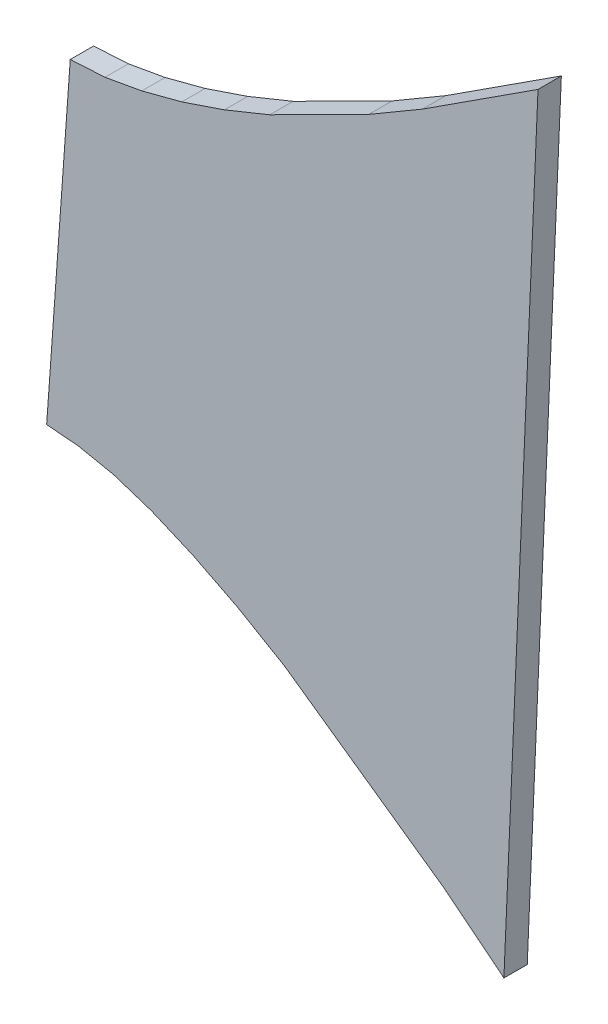
ISO-10303-21;
HEADER;
FILE_DESCRIPTION(('STEP AP214'),'2;1');
FILE_NAME('part.step','',(''),(''),'','','');
FILE_SCHEMA(('AUTOMOTIVE_DESIGN { 1 0 10303 214 1 1 1 1 }'));
ENDSEC;
DATA;
#1=APPLICATION_CONTEXT('core data for automotive mechanical design processes');
#2=APPLICATION_PROTOCOL_DEFINITION('international standard','automotive_design',2000,#1);
#3=PRODUCT_CONTEXT('',#1,'mechanical');
#4=PRODUCT('Part','Part','',(#3));
#5=PRODUCT_RELATED_PRODUCT_CATEGORY('part','',(#4));
#6=PRODUCT_DEFINITION_FORMATION('','',#4);
#7=PRODUCT_DEFINITION_CONTEXT('part definition',#1,'design');
#8=PRODUCT_DEFINITION('design','',#6,#7);
#9=PRODUCT_DEFINITION_SHAPE('','',#8);
#10=(LENGTH_UNIT() NAMED_UNIT(*) SI_UNIT(.MILLI.,.METRE.));
#11=(NAMED_UNIT(*) PLANE_ANGLE_UNIT() SI_UNIT($,.RADIAN.));
#12=(NAMED_UNIT(*) SI_UNIT($,.STERADIAN.) SOLID_ANGLE_UNIT());
#13=UNCERTAINTY_MEASURE_WITH_UNIT(LENGTH_MEASURE(1.E-05),#10,'distance_accuracy_value','');
#14=(GEOMETRIC_REPRESENTATION_CONTEXT(3) GLOBAL_UNCERTAINTY_ASSIGNED_CONTEXT((#13)) GLOBAL_UNIT_ASSIGNED_CONTEXT((#10,
#11,#12)) REPRESENTATION_CONTEXT('',''));
#15=CARTESIAN_POINT('',(0.,0.,0.));
#16=DIRECTION('',(0.,0.,1.));
#17=DIRECTION('',(1.,0.,0.));
#18=AXIS2_PLACEMENT_3D('',#15,#16,#17);
#19=CARTESIAN_POINT('',(46.9379997253418,111.75,0.));
#20=DIRECTION('',(0.0829995994922521,0.996549580544855,0.));
#21=DIRECTION('',(0.996549580544855,-0.0829995994922521,0.));
#22=AXIS2_PLACEMENT_3D('',#19,#20,#21);
#23=PLANE('',#22);
#24=DIRECTION('',(0.996549580544855,-0.0829995994922521,0.));
#25=VECTOR('',#24,1.);
#26=CARTESIAN_POINT('',(46.9379997253418,111.75,0.03556));
#27=LINE('',#26,#25);
#28=CARTESIAN_POINT('',(46.9379997253418,111.75,0.03556));
#29=VERTEX_POINT('',#28);
#30=CARTESIAN_POINT('',(46.9860000610352,111.746002197266,0.03556));
#31=VERTEX_POINT('',#30);
#32=EDGE_CURVE('E11',#29,#31,#27,.T.);
#33=ORIENTED_EDGE('',*,*,#32,.F.);
#34=DIRECTION('',(0.,0.,1.));
#35=VECTOR('',#34,1.);
#36=CARTESIAN_POINT('',(46.9379997253418,111.75,0.));
#37=LINE('',#36,#35);
#38=CARTESIAN_POINT('',(46.9379997253418,111.75,0.));
#39=VERTEX_POINT('',#38);
#40=EDGE_CURVE('E24',#39,#29,#37,.T.);
#41=ORIENTED_EDGE('',*,*,#40,.F.);
#42=DIRECTION('',(0.996549580544855,-0.0829995994922521,0.));
#43=VECTOR('',#42,1.);
#44=CARTESIAN_POINT('',(46.9379997253418,111.75,0.));
#45=LINE('',#44,#43);
#46=CARTESIAN_POINT('',(46.9860000610352,111.746002197266,0.));
#47=VERTEX_POINT('',#46);
#48=EDGE_CURVE('E160',#39,#47,#45,.T.);
#49=ORIENTED_EDGE('',*,*,#48,.T.);
#50=DIRECTION('',(0.,0.,1.));
#51=VECTOR('',#50,1.);
#52=CARTESIAN_POINT('',(46.9860000610352,111.746002197266,0.));
#53=LINE('',#52,#51);
#54=EDGE_CURVE('E37',#47,#31,#53,.T.);
#55=ORIENTED_EDGE('',*,*,#54,.T.);
#56=EDGE_LOOP('',(#33,#41,#49,#55));
#57=FACE_BOUND('',#56,.T.);
#58=ADVANCED_FACE('F17',(#57),#23,.F.);
#59=CARTESIAN_POINT('',(46.9860000610352,111.746002197266,0.));
#60=DIRECTION('',(0.199629097518284,0.979871534143143,0.));
#61=DIRECTION('',(0.979871534143143,-0.199629097518284,0.));
#62=AXIS2_PLACEMENT_3D('',#59,#60,#61);
#63=PLANE('',#62);
#64=DIRECTION('',(0.979871534143143,-0.199629097518284,0.));
#65=VECTOR('',#64,1.);
#66=CARTESIAN_POINT('',(46.9860000610352,111.746002197266,0.03556));
#67=LINE('',#66,#65);
#68=CARTESIAN_POINT('',(47.0400009155273,111.735000610352,0.03556));
#69=VERTEX_POINT('',#68);
#70=EDGE_CURVE('E280',#31,#69,#67,.T.);
#71=ORIENTED_EDGE('',*,*,#70,.F.);
#72=ORIENTED_EDGE('',*,*,#54,.F.);
#73=DIRECTION('',(0.979871534143143,-0.199629097518284,0.));
#74=VECTOR('',#73,1.);
#75=CARTESIAN_POINT('',(46.9860000610352,111.746002197266,0.));
#76=LINE('',#75,#74);
#77=CARTESIAN_POINT('',(47.0400009155273,111.735000610352,0.));
#78=VERTEX_POINT('',#77);
#79=EDGE_CURVE('E277',#47,#78,#76,.T.);
#80=ORIENTED_EDGE('',*,*,#79,.T.);
#81=DIRECTION('',(0.,0.,1.));
#82=VECTOR('',#81,1.);
#83=CARTESIAN_POINT('',(47.0400009155273,111.735000610352,0.));
#84=LINE('',#83,#82);
#85=EDGE_CURVE('E275',#78,#69,#84,.T.);
#86=ORIENTED_EDGE('',*,*,#85,.T.);
#87=EDGE_LOOP('',(#71,#72,#80,#86));
#88=FACE_BOUND('',#87,.T.);
#89=ADVANCED_FACE('F288',(#88),#63,.F.);
#90=CARTESIAN_POINT('',(47.0400009155273,111.735000610352,0.));
#91=DIRECTION('',(0.311273093429273,0.950320504517803,0.));
#92=DIRECTION('',(0.950320504517803,-0.311273093429273,0.));
#93=AXIS2_PLACEMENT_3D('',#90,#91,#92);
#94=PLANE('',#93);
#95=DIRECTION('',(0.950320504517803,-0.311273093429273,0.));
#96=VECTOR('',#95,1.);
#97=CARTESIAN_POINT('',(47.0400009155273,111.735000610352,0.03556));
#98=LINE('',#97,#96);
#99=CARTESIAN_POINT('',(47.0979995727539,111.716003417969,0.03556));
#100=VERTEX_POINT('',#99);
#101=EDGE_CURVE('E272',#69,#100,#98,.T.);
#102=ORIENTED_EDGE('',*,*,#101,.F.);
#103=ORIENTED_EDGE('',*,*,#85,.F.);
#104=DIRECTION('',(0.950320504517803,-0.311273093429273,0.));
#105=VECTOR('',#104,1.);
#106=CARTESIAN_POINT('',(47.0400009155273,111.735000610352,0.));
#107=LINE('',#106,#105);
#108=CARTESIAN_POINT('',(47.0979995727539,111.716003417969,0.));
#109=VERTEX_POINT('',#108);
#110=EDGE_CURVE('E269',#78,#109,#107,.T.);
#111=ORIENTED_EDGE('',*,*,#110,.T.);
#112=DIRECTION('',(0.,0.,1.));
#113=VECTOR('',#112,1.);
#114=CARTESIAN_POINT('',(47.0979995727539,111.716003417969,0.));
#115=LINE('',#114,#113);
#116=EDGE_CURVE('E267',#109,#100,#115,.T.);
#117=ORIENTED_EDGE('',*,*,#116,.T.);
#118=EDGE_LOOP('',(#102,#103,#111,#117));
#119=FACE_BOUND('',#118,.T.);
#120=ADVANCED_FACE('F294',(#119),#94,.F.);
#121=CARTESIAN_POINT('',(47.0979995727539,111.716003417969,0.));
#122=DIRECTION('',(0.393926015550138,0.919142151287162,0.));
#123=DIRECTION('',(0.919142151287162,-0.393926015550138,0.));
#124=AXIS2_PLACEMENT_3D('',#121,#122,#123);
#125=PLANE('',#124);
#126=DIRECTION('',(0.919142151287162,-0.393926015550138,0.));
#127=VECTOR('',#126,1.);
#128=CARTESIAN_POINT('',(47.0979995727539,111.716003417969,0.03556));
#129=LINE('',#128,#127);
#130=CARTESIAN_POINT('',(47.1609992980957,111.689002990723,0.03556));
#131=VERTEX_POINT('',#130);
#132=EDGE_CURVE('E264',#100,#131,#129,.T.);
#133=ORIENTED_EDGE('',*,*,#132,.F.);
#134=ORIENTED_EDGE('',*,*,#116,.F.);
#135=DIRECTION('',(0.919142151287162,-0.393926015550138,0.));
#136=VECTOR('',#135,1.);
#137=CARTESIAN_POINT('',(47.0979995727539,111.716003417969,0.));
#138=LINE('',#137,#136);
#139=CARTESIAN_POINT('',(47.1609992980957,111.689002990723,0.));
#140=VERTEX_POINT('',#139);
#141=EDGE_CURVE('E261',#109,#140,#138,.T.);
#142=ORIENTED_EDGE('',*,*,#141,.T.);
#143=DIRECTION('',(0.,0.,1.));
#144=VECTOR('',#143,1.);
#145=CARTESIAN_POINT('',(47.1609992980957,111.689002990723,0.));
#146=LINE('',#145,#144);
#147=EDGE_CURVE('E259',#140,#131,#146,.T.);
#148=ORIENTED_EDGE('',*,*,#147,.T.);
#149=EDGE_LOOP('',(#133,#134,#142,#148));
#150=FACE_BOUND('',#149,.T.);
#151=ADVANCED_FACE('F296',(#150),#125,.F.);
#152=CARTESIAN_POINT('',(47.1609992980957,111.689002990723,0.));
#153=DIRECTION('',(0.452566910300874,0.891730447893712,0.));
#154=DIRECTION('',(0.891730447893712,-0.452566910300874,0.));
#155=AXIS2_PLACEMENT_3D('',#152,#153,#154);
#156=PLANE('',#155);
#157=DIRECTION('',(0.891730447893712,-0.452566910300874,0.));
#158=VECTOR('',#157,1.);
#159=CARTESIAN_POINT('',(47.1609992980957,111.689002990723,0.03556));
#160=LINE('',#159,#158);
#161=CARTESIAN_POINT('',(47.2280006408691,111.654998779297,0.03556));
#162=VERTEX_POINT('',#161);
#163=EDGE_CURVE('E256',#131,#162,#160,.T.);
#164=ORIENTED_EDGE('',*,*,#163,.F.);
#165=ORIENTED_EDGE('',*,*,#147,.F.);
#166=DIRECTION('',(0.891730447893712,-0.452566910300874,0.));
#167=VECTOR('',#166,1.);
#168=CARTESIAN_POINT('',(47.1609992980957,111.689002990723,0.));
#169=LINE('',#168,#167);
#170=CARTESIAN_POINT('',(47.2280006408691,111.654998779297,0.));
#171=VERTEX_POINT('',#170);
#172=EDGE_CURVE('E253',#140,#171,#169,.T.);
#173=ORIENTED_EDGE('',*,*,#172,.T.);
#174=DIRECTION('',(0.,0.,1.));
#175=VECTOR('',#174,1.);
#176=CARTESIAN_POINT('',(47.2280006408691,111.654998779297,0.));
#177=LINE('',#176,#175);
#178=EDGE_CURVE('E251',#171,#162,#177,.T.);
#179=ORIENTED_EDGE('',*,*,#178,.T.);
#180=EDGE_LOOP('',(#164,#165,#173,#179));
#181=FACE_BOUND('',#180,.T.);
#182=ADVANCED_FACE('F301',(#181),#156,.F.);
#183=CARTESIAN_POINT('',(47.2280006408691,111.654998779297,0.));
#184=DIRECTION('',(0.503876716543535,0.863775581111961,0.));
#185=DIRECTION('',(0.863775581111961,-0.503876716543535,0.));
#186=AXIS2_PLACEMENT_3D('',#183,#184,#185);
#187=PLANE('',#186);
#188=DIRECTION('',(0.863775581111961,-0.503876716543535,0.));
#189=VECTOR('',#188,1.);
#190=CARTESIAN_POINT('',(47.2280006408691,111.654998779297,0.03556));
#191=LINE('',#190,#189);
#192=CARTESIAN_POINT('',(47.2999992370605,111.612998962402,0.03556));
#193=VERTEX_POINT('',#192);
#194=EDGE_CURVE('E248',#162,#193,#191,.T.);
#195=ORIENTED_EDGE('',*,*,#194,.F.);
#196=ORIENTED_EDGE('',*,*,#178,.F.);
#197=DIRECTION('',(0.863775581111961,-0.503876716543535,0.));
#198=VECTOR('',#197,1.);
#199=CARTESIAN_POINT('',(47.2280006408691,111.654998779297,0.));
#200=LINE('',#199,#198);
#201=CARTESIAN_POINT('',(47.2999992370605,111.612998962402,0.));
#202=VERTEX_POINT('',#201);
#203=EDGE_CURVE('E245',#171,#202,#200,.T.);
#204=ORIENTED_EDGE('',*,*,#203,.T.);
#205=DIRECTION('',(0.,0.,1.));
#206=VECTOR('',#205,1.);
#207=CARTESIAN_POINT('',(47.2999992370605,111.612998962402,0.));
#208=LINE('',#207,#206);
#209=EDGE_CURVE('E243',#202,#193,#208,.T.);
#210=ORIENTED_EDGE('',*,*,#209,.T.);
#211=EDGE_LOOP('',(#195,#196,#204,#210));
#212=FACE_BOUND('',#211,.T.);
#213=ADVANCED_FACE('F304',(#212),#187,.F.);
#214=CARTESIAN_POINT('',(47.2999992370605,111.612998962402,0.));
#215=DIRECTION('',(0.576151282625099,0.817343073335459,0.));
#216=DIRECTION('',(0.817343073335459,-0.576151282625099,0.));
#217=AXIS2_PLACEMENT_3D('',#214,#215,#216);
#218=PLANE('',#217);
#219=DIRECTION('',(0.817343073335459,-0.576151282625099,0.));
#220=VECTOR('',#219,1.);
#221=CARTESIAN_POINT('',(47.2999992370605,111.612998962402,0.03556));
#222=LINE('',#221,#220);
#223=CARTESIAN_POINT('',(47.5439987182617,111.44100189209,0.03556));
#224=VERTEX_POINT('',#223);
#225=EDGE_CURVE('E240',#193,#224,#222,.T.);
#226=ORIENTED_EDGE('',*,*,#225,.F.);
#227=ORIENTED_EDGE('',*,*,#209,.F.);
#228=DIRECTION('',(0.817343073335459,-0.576151282625099,0.));
#229=VECTOR('',#228,1.);
#230=CARTESIAN_POINT('',(47.2999992370605,111.612998962402,0.));
#231=LINE('',#230,#229);
#232=CARTESIAN_POINT('',(47.5439987182617,111.44100189209,0.));
#233=VERTEX_POINT('',#232);
#234=EDGE_CURVE('E237',#202,#233,#231,.T.);
#235=ORIENTED_EDGE('',*,*,#234,.T.);
#236=DIRECTION('',(0.,0.,1.));
#237=VECTOR('',#236,1.);
#238=CARTESIAN_POINT('',(47.5439987182617,111.44100189209,0.));
#239=LINE('',#238,#237);
#240=EDGE_CURVE('E235',#233,#224,#239,.T.);
#241=ORIENTED_EDGE('',*,*,#240,.T.);
#242=EDGE_LOOP('',(#226,#227,#235,#241));
#243=FACE_BOUND('',#242,.T.);
#244=ADVANCED_FACE('F309',(#243),#218,.F.);
#245=CARTESIAN_POINT('',(47.5439987182617,111.44100189209,0.));
#246=DIRECTION('',(0.625771089681045,0.780006758508795,0.));
#247=DIRECTION('',(0.780006758508795,-0.625771089681045,0.));
#248=AXIS2_PLACEMENT_3D('',#245,#246,#247);
#249=PLANE('',#248);
#250=DIRECTION('',(0.780006758508795,-0.625771089681045,0.));
#251=VECTOR('',#250,1.);
#252=CARTESIAN_POINT('',(47.5439987182617,111.44100189209,0.03556));
#253=LINE('',#252,#251);
#254=CARTESIAN_POINT('',(47.6349983215332,111.36799621582,0.03556));
#255=VERTEX_POINT('',#254);
#256=EDGE_CURVE('E232',#224,#255,#253,.T.);
#257=ORIENTED_EDGE('',*,*,#256,.F.);
#258=ORIENTED_EDGE('',*,*,#240,.F.);
#259=DIRECTION('',(0.780006758508795,-0.625771089681045,0.));
#260=VECTOR('',#259,1.);
#261=CARTESIAN_POINT('',(47.5439987182617,111.44100189209,0.));
#262=LINE('',#261,#260);
#263=CARTESIAN_POINT('',(47.6349983215332,111.36799621582,0.));
#264=VERTEX_POINT('',#263);
#265=EDGE_CURVE('E229',#233,#264,#262,.T.);
#266=ORIENTED_EDGE('',*,*,#265,.T.);
#267=DIRECTION('',(0.,0.,1.));
#268=VECTOR('',#267,1.);
#269=CARTESIAN_POINT('',(47.6349983215332,111.36799621582,0.));
#270=LINE('',#269,#268);
#271=EDGE_CURVE('E227',#264,#255,#270,.T.);
#272=ORIENTED_EDGE('',*,*,#271,.T.);
#273=EDGE_LOOP('',(#257,#258,#266,#272));
#274=FACE_BOUND('',#273,.T.);
#275=ADVANCED_FACE('F312',(#274),#249,.F.);
#276=CARTESIAN_POINT('',(47.6349983215332,111.36799621582,0.));
#277=DIRECTION('',(-0.999060806518377,0.0433301843851285,0.));
#278=DIRECTION('',(0.0433301843851285,0.999060806518377,0.));
#279=AXIS2_PLACEMENT_3D('',#276,#277,#278);
#280=PLANE('',#279);
#281=DIRECTION('',(0.0433301843851285,0.999060806518377,0.));
#282=VECTOR('',#281,1.);
#283=CARTESIAN_POINT('',(47.6349983215332,111.36799621582,0.03556));
#284=LINE('',#283,#282);
#285=CARTESIAN_POINT('',(47.6870002746582,112.567001342773,0.03556));
#286=VERTEX_POINT('',#285);
#287=EDGE_CURVE('E224',#255,#286,#284,.T.);
#288=ORIENTED_EDGE('',*,*,#287,.F.);
#289=ORIENTED_EDGE('',*,*,#271,.F.);
#290=DIRECTION('',(0.0433301843851285,0.999060806518377,0.));
#291=VECTOR('',#290,1.);
#292=CARTESIAN_POINT('',(47.6349983215332,111.36799621582,0.));
#293=LINE('',#292,#291);
#294=CARTESIAN_POINT('',(47.6870002746582,112.567001342773,0.));
#295=VERTEX_POINT('',#294);
#296=EDGE_CURVE('E221',#264,#295,#293,.T.);
#297=ORIENTED_EDGE('',*,*,#296,.T.);
#298=DIRECTION('',(0.,0.,1.));
#299=VECTOR('',#298,1.);
#300=CARTESIAN_POINT('',(47.6870002746582,112.567001342773,0.));
#301=LINE('',#300,#299);
#302=EDGE_CURVE('E219',#295,#286,#301,.T.);
#303=ORIENTED_EDGE('',*,*,#302,.T.);
#304=EDGE_LOOP('',(#288,#289,#297,#303));
#305=FACE_BOUND('',#304,.T.);
#306=ADVANCED_FACE('F317',(#305),#280,.F.);
#307=CARTESIAN_POINT('',(47.6870002746582,112.567001342773,0.));
#308=DIRECTION('',(0.543644206223087,-0.839315779096324,0.));
#309=DIRECTION('',(-0.839315779096324,-0.543644206223087,0.));
#310=AXIS2_PLACEMENT_3D('',#307,#308,#309);
#311=PLANE('',#310);
#312=DIRECTION('',(-0.839315779096324,-0.543644206223087,0.));
#313=VECTOR('',#312,1.);
#314=CARTESIAN_POINT('',(47.6870002746582,112.567001342773,0.03556));
#315=LINE('',#314,#313);
#316=CARTESIAN_POINT('',(47.5110015869141,112.453002929688,0.03556));
#317=VERTEX_POINT('',#316);
#318=EDGE_CURVE('E216',#286,#317,#315,.T.);
#319=ORIENTED_EDGE('',*,*,#318,.F.);
#320=ORIENTED_EDGE('',*,*,#302,.F.);
#321=DIRECTION('',(-0.839315779096324,-0.543644206223087,0.));
#322=VECTOR('',#321,1.);
#323=CARTESIAN_POINT('',(47.6870002746582,112.567001342773,0.));
#324=LINE('',#323,#322);
#325=CARTESIAN_POINT('',(47.5110015869141,112.453002929688,0.));
#326=VERTEX_POINT('',#325);
#327=EDGE_CURVE('E213',#295,#326,#324,.T.);
#328=ORIENTED_EDGE('',*,*,#327,.T.);
#329=DIRECTION('',(0.,0.,1.));
#330=VECTOR('',#329,1.);
#331=CARTESIAN_POINT('',(47.5110015869141,112.453002929688,0.));
#332=LINE('',#331,#330);
#333=EDGE_CURVE('E211',#326,#317,#332,.T.);
#334=ORIENTED_EDGE('',*,*,#333,.T.);
#335=EDGE_LOOP('',(#319,#320,#328,#334));
#336=FACE_BOUND('',#335,.T.);
#337=ADVANCED_FACE('F320',(#336),#311,.F.);
#338=CARTESIAN_POINT('',(47.5110015869141,112.453002929688,0.));
#339=DIRECTION('',(0.505208373140228,-0.862997392643225,0.));
#340=DIRECTION('',(-0.862997392643225,-0.505208373140228,0.));
#341=AXIS2_PLACEMENT_3D('',#338,#339,#340);
#342=PLANE('',#341);
#343=DIRECTION('',(-0.862997392643225,-0.505208373140228,0.));
#344=VECTOR('',#343,1.);
#345=CARTESIAN_POINT('',(47.5110015869141,112.453002929688,0.03556));
#346=LINE('',#345,#344);
#347=CARTESIAN_POINT('',(47.4290008544922,112.404998779297,0.03556));
#348=VERTEX_POINT('',#347);
#349=EDGE_CURVE('E208',#317,#348,#346,.T.);
#350=ORIENTED_EDGE('',*,*,#349,.F.);
#351=ORIENTED_EDGE('',*,*,#333,.F.);
#352=DIRECTION('',(-0.862997392643225,-0.505208373140228,0.));
#353=VECTOR('',#352,1.);
#354=CARTESIAN_POINT('',(47.5110015869141,112.453002929688,0.));
#355=LINE('',#354,#353);
#356=CARTESIAN_POINT('',(47.4290008544922,112.404998779297,0.));
#357=VERTEX_POINT('',#356);
#358=EDGE_CURVE('E205',#326,#357,#355,.T.);
#359=ORIENTED_EDGE('',*,*,#358,.T.);
#360=DIRECTION('',(0.,0.,1.));
#361=VECTOR('',#360,1.);
#362=CARTESIAN_POINT('',(47.4290008544922,112.404998779297,0.));
#363=LINE('',#362,#361);
#364=EDGE_CURVE('E203',#357,#348,#363,.T.);
#365=ORIENTED_EDGE('',*,*,#364,.T.);
#366=EDGE_LOOP('',(#350,#351,#359,#365));
#367=FACE_BOUND('',#366,.T.);
#368=ADVANCED_FACE('F325',(#367),#342,.F.);
#369=CARTESIAN_POINT('',(47.4290008544922,112.404998779297,0.));
#370=DIRECTION('',(0.449558915144308,-0.893250682515425,0.));
#371=DIRECTION('',(-0.893250682515425,-0.449558915144308,0.));
#372=AXIS2_PLACEMENT_3D('',#369,#370,#371);
#373=PLANE('',#372);
#374=DIRECTION('',(-0.893250682515425,-0.449558915144308,0.));
#375=VECTOR('',#374,1.);
#376=CARTESIAN_POINT('',(47.4290008544922,112.404998779297,0.03556));
#377=LINE('',#376,#375);
#378=CARTESIAN_POINT('',(47.2779998779297,112.329002380371,0.03556));
#379=VERTEX_POINT('',#378);
#380=EDGE_CURVE('E200',#348,#379,#377,.T.);
#381=ORIENTED_EDGE('',*,*,#380,.F.);
#382=ORIENTED_EDGE('',*,*,#364,.F.);
#383=DIRECTION('',(-0.893250682515425,-0.449558915144308,0.));
#384=VECTOR('',#383,1.);
#385=CARTESIAN_POINT('',(47.4290008544922,112.404998779297,0.));
#386=LINE('',#385,#384);
#387=CARTESIAN_POINT('',(47.2779998779297,112.329002380371,0.));
#388=VERTEX_POINT('',#387);
#389=EDGE_CURVE('E197',#357,#388,#386,.T.);
#390=ORIENTED_EDGE('',*,*,#389,.T.);
#391=DIRECTION('',(0.,0.,1.));
#392=VECTOR('',#391,1.);
#393=CARTESIAN_POINT('',(47.2779998779297,112.329002380371,0.));
#394=LINE('',#393,#392);
#395=EDGE_CURVE('E195',#388,#379,#394,.T.);
#396=ORIENTED_EDGE('',*,*,#395,.T.);
#397=EDGE_LOOP('',(#381,#382,#390,#396));
#398=FACE_BOUND('',#397,.T.);
#399=ADVANCED_FACE('F328',(#398),#373,.F.);
#400=CARTESIAN_POINT('',(47.2779998779297,112.329002380371,0.));
#401=DIRECTION('',(0.376014256166483,-0.926613878138875,0.));
#402=DIRECTION('',(-0.926613878138875,-0.376014256166483,0.));
#403=AXIS2_PLACEMENT_3D('',#400,#401,#402);
#404=PLANE('',#403);
#405=DIRECTION('',(-0.926613878138875,-0.376014256166483,0.));
#406=VECTOR('',#405,1.);
#407=CARTESIAN_POINT('',(47.2779998779297,112.329002380371,0.03556));
#408=LINE('',#407,#406);
#409=CARTESIAN_POINT('',(47.2089996337891,112.301002502441,0.03556));
#410=VERTEX_POINT('',#409);
#411=EDGE_CURVE('E192',#379,#410,#408,.T.);
#412=ORIENTED_EDGE('',*,*,#411,.F.);
#413=ORIENTED_EDGE('',*,*,#395,.F.);
#414=DIRECTION('',(-0.926613878138875,-0.376014256166483,0.));
#415=VECTOR('',#414,1.);
#416=CARTESIAN_POINT('',(47.2779998779297,112.329002380371,0.));
#417=LINE('',#416,#415);
#418=CARTESIAN_POINT('',(47.2089996337891,112.301002502441,0.));
#419=VERTEX_POINT('',#418);
#420=EDGE_CURVE('E189',#388,#419,#417,.T.);
#421=ORIENTED_EDGE('',*,*,#420,.T.);
#422=DIRECTION('',(0.,0.,1.));
#423=VECTOR('',#422,1.);
#424=CARTESIAN_POINT('',(47.2089996337891,112.301002502441,0.));
#425=LINE('',#424,#423);
#426=EDGE_CURVE('E187',#419,#410,#425,.T.);
#427=ORIENTED_EDGE('',*,*,#426,.T.);
#428=EDGE_LOOP('',(#412,#413,#421,#427));
#429=FACE_BOUND('',#428,.T.);
#430=ADVANCED_FACE('F333',(#429),#404,.F.);
#431=CARTESIAN_POINT('',(47.2089996337891,112.301002502441,0.));
#432=DIRECTION('',(0.320643748373978,-0.947199866252464,0.));
#433=DIRECTION('',(-0.947199866252464,-0.320643748373978,0.));
#434=AXIS2_PLACEMENT_3D('',#431,#432,#433);
#435=PLANE('',#434);
#436=DIRECTION('',(-0.947199866252464,-0.320643748373978,0.));
#437=VECTOR('',#436,1.);
#438=CARTESIAN_POINT('',(47.2089996337891,112.301002502441,0.03556));
#439=LINE('',#438,#437);
#440=CARTESIAN_POINT('',(47.1440010070801,112.278999328613,0.03556));
#441=VERTEX_POINT('',#440);
#442=EDGE_CURVE('E184',#410,#441,#439,.T.);
#443=ORIENTED_EDGE('',*,*,#442,.F.);
#444=ORIENTED_EDGE('',*,*,#426,.F.);
#445=DIRECTION('',(-0.947199866252464,-0.320643748373978,0.));
#446=VECTOR('',#445,1.);
#447=CARTESIAN_POINT('',(47.2089996337891,112.301002502441,0.));
#448=LINE('',#447,#446);
#449=CARTESIAN_POINT('',(47.1440010070801,112.278999328613,0.));
#450=VERTEX_POINT('',#449);
#451=EDGE_CURVE('E181',#419,#450,#448,.T.);
#452=ORIENTED_EDGE('',*,*,#451,.T.);
#453=DIRECTION('',(0.,0.,1.));
#454=VECTOR('',#453,1.);
#455=CARTESIAN_POINT('',(47.1440010070801,112.278999328613,0.));
#456=LINE('',#455,#454);
#457=EDGE_CURVE('E179',#450,#441,#456,.T.);
#458=ORIENTED_EDGE('',*,*,#457,.T.);
#459=EDGE_LOOP('',(#443,#444,#452,#458));
#460=FACE_BOUND('',#459,.T.);
#461=ADVANCED_FACE('F336',(#460),#435,.F.);
#462=CARTESIAN_POINT('',(47.1440010070801,112.278999328613,0.));
#463=DIRECTION('',(0.253692276769749,-0.967284978022186,0.));
#464=DIRECTION('',(-0.967284978022186,-0.253692276769749,0.));
#465=AXIS2_PLACEMENT_3D('',#462,#463,#464);
#466=PLANE('',#465);
#467=DIRECTION('',(-0.967284978022186,-0.253692276769748,0.));
#468=VECTOR('',#467,1.);
#469=CARTESIAN_POINT('',(47.1440010070801,112.278999328613,0.03556));
#470=LINE('',#469,#468);
#471=CARTESIAN_POINT('',(47.0830001831055,112.263000488281,0.03556));
#472=VERTEX_POINT('',#471);
#473=EDGE_CURVE('E176',#441,#472,#470,.T.);
#474=ORIENTED_EDGE('',*,*,#473,.F.);
#475=ORIENTED_EDGE('',*,*,#457,.F.);
#476=DIRECTION('',(-0.967284978022186,-0.253692276769748,0.));
#477=VECTOR('',#476,1.);
#478=CARTESIAN_POINT('',(47.1440010070801,112.278999328613,0.));
#479=LINE('',#478,#477);
#480=CARTESIAN_POINT('',(47.0830001831055,112.263000488281,0.));
#481=VERTEX_POINT('',#480);
#482=EDGE_CURVE('E173',#450,#481,#479,.T.);
#483=ORIENTED_EDGE('',*,*,#482,.T.);
#484=DIRECTION('',(0.,0.,1.));
#485=VECTOR('',#484,1.);
#486=CARTESIAN_POINT('',(47.0830001831055,112.263000488281,0.));
#487=LINE('',#486,#485);
#488=EDGE_CURVE('E171',#481,#472,#487,.T.);
#489=ORIENTED_EDGE('',*,*,#488,.T.);
#490=EDGE_LOOP('',(#474,#475,#483,#489));
#491=FACE_BOUND('',#490,.T.);
#492=ADVANCED_FACE('F341',(#491),#466,.F.);
#493=CARTESIAN_POINT('',(47.0830001831055,112.263000488281,0.));
#494=DIRECTION('',(0.175827773431546,-0.984420943545039,0.));
#495=DIRECTION('',(-0.984420943545039,-0.175827773431546,0.));
#496=AXIS2_PLACEMENT_3D('',#493,#494,#495);
#497=PLANE('',#496);
#498=DIRECTION('',(-0.984420943545039,-0.175827773431546,0.));
#499=VECTOR('',#498,1.);
#500=CARTESIAN_POINT('',(47.0830001831055,112.263000488281,0.03556));
#501=LINE('',#500,#499);
#502=CARTESIAN_POINT('',(47.0270004272461,112.252998352051,0.03556));
#503=VERTEX_POINT('',#502);
#504=EDGE_CURVE('E168',#472,#503,#501,.T.);
#505=ORIENTED_EDGE('',*,*,#504,.F.);
#506=ORIENTED_EDGE('',*,*,#488,.F.);
#507=DIRECTION('',(-0.984420943545039,-0.175827773431546,0.));
#508=VECTOR('',#507,1.);
#509=CARTESIAN_POINT('',(47.0830001831055,112.263000488281,0.));
#510=LINE('',#509,#508);
#511=CARTESIAN_POINT('',(47.0270004272461,112.252998352051,0.));
#512=VERTEX_POINT('',#511);
#513=EDGE_CURVE('E166',#481,#512,#510,.T.);
#514=ORIENTED_EDGE('',*,*,#513,.T.);
#515=DIRECTION('',(0.,0.,1.));
#516=VECTOR('',#515,1.);
#517=CARTESIAN_POINT('',(47.0270004272461,112.252998352051,0.));
#518=LINE('',#517,#516);
#519=EDGE_CURVE('E151',#512,#503,#518,.T.);
#520=ORIENTED_EDGE('',*,*,#519,.T.);
#521=EDGE_LOOP('',(#505,#506,#514,#520));
#522=FACE_BOUND('',#521,.T.);
#523=ADVANCED_FACE('F343',(#522),#497,.F.);
#524=CARTESIAN_POINT('',(47.0270004272461,112.252998352051,0.));
#525=DIRECTION('',(0.0564808761638735,-0.99840368119702,0.));
#526=DIRECTION('',(-0.99840368119702,-0.0564808761638735,0.));
#527=AXIS2_PLACEMENT_3D('',#524,#525,#526);
#528=PLANE('',#527);
#529=DIRECTION('',(-0.99840368119702,-0.0564808761638735,0.));
#530=VECTOR('',#529,1.);
#531=CARTESIAN_POINT('',(47.0270004272461,112.252998352051,0.03556));
#532=LINE('',#531,#530);
#533=CARTESIAN_POINT('',(46.9739990234375,112.25,0.03556));
#534=VERTEX_POINT('',#533);
#535=EDGE_CURVE('E155',#503,#534,#532,.T.);
#536=ORIENTED_EDGE('',*,*,#535,.F.);
#537=ORIENTED_EDGE('',*,*,#519,.F.);
#538=DIRECTION('',(-0.99840368119702,-0.0564808761638735,0.));
#539=VECTOR('',#538,1.);
#540=CARTESIAN_POINT('',(47.0270004272461,112.252998352051,0.));
#541=LINE('',#540,#539);
#542=CARTESIAN_POINT('',(46.9739990234375,112.25,0.));
#543=VERTEX_POINT('',#542);
#544=EDGE_CURVE('E147',#512,#543,#541,.T.);
#545=ORIENTED_EDGE('',*,*,#544,.T.);
#546=DIRECTION('',(0.,0.,1.));
#547=VECTOR('',#546,1.);
#548=CARTESIAN_POINT('',(46.9739990234375,112.25,0.));
#549=LINE('',#548,#547);
#550=EDGE_CURVE('E137',#543,#534,#549,.T.);
#551=ORIENTED_EDGE('',*,*,#550,.T.);
#552=EDGE_LOOP('',(#536,#537,#545,#551));
#553=FACE_BOUND('',#552,.T.);
#554=ADVANCED_FACE('F150',(#553),#528,.F.);
#555=CARTESIAN_POINT('',(46.9739990234375,112.25,0.));
#556=DIRECTION('',(0.997418134649279,-0.0718127055105992,0.));
#557=DIRECTION('',(-0.0718127055105992,-0.997418134649279,0.));
#558=AXIS2_PLACEMENT_3D('',#555,#556,#557);
#559=PLANE('',#558);
#560=DIRECTION('',(-0.0718127055105991,-0.997418134649279,0.));
#561=VECTOR('',#560,1.);
#562=CARTESIAN_POINT('',(46.9739990234375,112.25,0.03556));
#563=LINE('',#562,#561);
#564=EDGE_CURVE('E143',#534,#29,#563,.T.);
#565=ORIENTED_EDGE('',*,*,#564,.F.);
#566=ORIENTED_EDGE('',*,*,#550,.F.);
#567=DIRECTION('',(-0.0718127055105991,-0.997418134649279,0.));
#568=VECTOR('',#567,1.);
#569=CARTESIAN_POINT('',(46.9739990234375,112.25,0.));
#570=LINE('',#569,#568);
#571=EDGE_CURVE('E141',#543,#39,#570,.T.);
#572=ORIENTED_EDGE('',*,*,#571,.T.);
#573=ORIENTED_EDGE('',*,*,#40,.T.);
#574=EDGE_LOOP('',(#565,#566,#572,#573));
#575=FACE_BOUND('',#574,.T.);
#576=ADVANCED_FACE('F139',(#575),#559,.F.);
#577=CARTESIAN_POINT('',(46.9379997253418,111.75,0.));
#578=DIRECTION('',(0.,0.,1.));
#579=DIRECTION('',(1.,0.,0.));
#580=AXIS2_PLACEMENT_3D('',#577,#578,#579);
#581=PLANE('',#580);
#582=ORIENTED_EDGE('',*,*,#571,.F.);
#583=ORIENTED_EDGE('',*,*,#544,.F.);
#584=ORIENTED_EDGE('',*,*,#513,.F.);
#585=ORIENTED_EDGE('',*,*,#482,.F.);
#586=ORIENTED_EDGE('',*,*,#451,.F.);
#587=ORIENTED_EDGE('',*,*,#420,.F.);
#588=ORIENTED_EDGE('',*,*,#389,.F.);
#589=ORIENTED_EDGE('',*,*,#358,.F.);
#590=ORIENTED_EDGE('',*,*,#327,.F.);
#591=ORIENTED_EDGE('',*,*,#296,.F.);
#592=ORIENTED_EDGE('',*,*,#265,.F.);
#593=ORIENTED_EDGE('',*,*,#234,.F.);
#594=ORIENTED_EDGE('',*,*,#203,.F.);
#595=ORIENTED_EDGE('',*,*,#172,.F.);
#596=ORIENTED_EDGE('',*,*,#141,.F.);
#597=ORIENTED_EDGE('',*,*,#110,.F.);
#598=ORIENTED_EDGE('',*,*,#79,.F.);
#599=ORIENTED_EDGE('',*,*,#48,.F.);
#600=EDGE_LOOP('',(#582,#583,#584,#585,#586,#587,#588,#589,#590,#591,#592,#593,#594,#595,#596,
#597,#598,#599));
#601=FACE_BOUND('',#600,.T.);
#602=ADVANCED_FACE('F158',(#601),#581,.F.);
#603=CARTESIAN_POINT('',(46.9379997253418,111.75,0.03556));
#604=DIRECTION('',(0.,0.,1.));
#605=DIRECTION('',(1.,0.,0.));
#606=AXIS2_PLACEMENT_3D('',#603,#604,#605);
#607=PLANE('',#606);
#608=ORIENTED_EDGE('',*,*,#32,.T.);
#609=ORIENTED_EDGE('',*,*,#70,.T.);
#610=ORIENTED_EDGE('',*,*,#101,.T.);
#611=ORIENTED_EDGE('',*,*,#132,.T.);
#612=ORIENTED_EDGE('',*,*,#163,.T.);
#613=ORIENTED_EDGE('',*,*,#194,.T.);
#614=ORIENTED_EDGE('',*,*,#225,.T.);
#615=ORIENTED_EDGE('',*,*,#256,.T.);
#616=ORIENTED_EDGE('',*,*,#287,.T.);
#617=ORIENTED_EDGE('',*,*,#318,.T.);
#618=ORIENTED_EDGE('',*,*,#349,.T.);
#619=ORIENTED_EDGE('',*,*,#380,.T.);
#620=ORIENTED_EDGE('',*,*,#411,.T.);
#621=ORIENTED_EDGE('',*,*,#442,.T.);
#622=ORIENTED_EDGE('',*,*,#473,.T.);
#623=ORIENTED_EDGE('',*,*,#504,.T.);
#624=ORIENTED_EDGE('',*,*,#535,.T.);
#625=ORIENTED_EDGE('',*,*,#564,.T.);
#626=EDGE_LOOP('',(#608,#609,#610,#611,#612,#613,#614,#615,#616,#617,#618,#619,#620,#621,#622,
#623,#624,#625));
#627=FACE_BOUND('',#626,.T.);
#628=ADVANCED_FACE('F291',(#627),#607,.T.);
#629=CLOSED_SHELL('',(#58,#89,#120,#151,#182,#213,#244,#275,#306,#337,#368,#399,#430,#461,#492,
#523,#554,#576,#602,#628));
#630=MANIFOLD_SOLID_BREP('B1',#629);
#631=ADVANCED_BREP_SHAPE_REPRESENTATION('',(#18,#630),#14);
#632=SHAPE_DEFINITION_REPRESENTATION(#9,#631);
ENDSEC;
END-ISO-10303-21;
